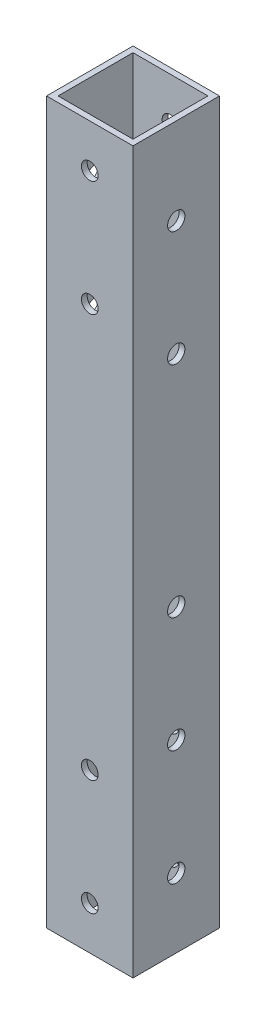
ISO-10303-21;
HEADER;
FILE_DESCRIPTION(('STEP AP214'),'2;1');
FILE_NAME('part.step','',(''),(''),'','','');
FILE_SCHEMA(('AUTOMOTIVE_DESIGN { 1 0 10303 214 1 1 1 1 }'));
ENDSEC;
DATA;
#1=APPLICATION_CONTEXT('core data for automotive mechanical design processes');
#2=APPLICATION_PROTOCOL_DEFINITION('international standard','automotive_design',2000,#1);
#3=PRODUCT_CONTEXT('',#1,'mechanical');
#4=PRODUCT('Part','Part','',(#3));
#5=PRODUCT_RELATED_PRODUCT_CATEGORY('part','',(#4));
#6=PRODUCT_DEFINITION_FORMATION('','',#4);
#7=PRODUCT_DEFINITION_CONTEXT('part definition',#1,'design');
#8=PRODUCT_DEFINITION('design','',#6,#7);
#9=PRODUCT_DEFINITION_SHAPE('','',#8);
#10=(LENGTH_UNIT() NAMED_UNIT(*) SI_UNIT(.MILLI.,.METRE.));
#11=(NAMED_UNIT(*) PLANE_ANGLE_UNIT() SI_UNIT($,.RADIAN.));
#12=(NAMED_UNIT(*) SI_UNIT($,.STERADIAN.) SOLID_ANGLE_UNIT());
#13=UNCERTAINTY_MEASURE_WITH_UNIT(LENGTH_MEASURE(1.E-05),#10,'distance_accuracy_value','');
#14=(GEOMETRIC_REPRESENTATION_CONTEXT(3) GLOBAL_UNCERTAINTY_ASSIGNED_CONTEXT((#13)) GLOBAL_UNIT_ASSIGNED_CONTEXT((#10,
#11,#12)) REPRESENTATION_CONTEXT('',''));
#15=CARTESIAN_POINT('',(0.,0.,0.));
#16=DIRECTION('',(0.,0.,1.));
#17=DIRECTION('',(1.,0.,0.));
#18=AXIS2_PLACEMENT_3D('',#15,#16,#17);
#19=CARTESIAN_POINT('',(0.,125.,0.));
#20=DIRECTION('',(0.,1.,0.));
#21=DIRECTION('',(0.,0.,1.));
#22=AXIS2_PLACEMENT_3D('',#19,#20,#21);
#23=PLANE('',#22);
#24=DIRECTION('',(0.,0.,-1.));
#25=VECTOR('',#24,1.);
#26=CARTESIAN_POINT('',(7.5,125.,7.5));
#27=LINE('',#26,#25);
#28=CARTESIAN_POINT('',(7.5,125.,7.5));
#29=VERTEX_POINT('',#28);
#30=CARTESIAN_POINT('',(7.5,125.,-7.5));
#31=VERTEX_POINT('',#30);
#32=EDGE_CURVE('E187',#29,#31,#27,.T.);
#33=ORIENTED_EDGE('',*,*,#32,.T.);
#34=DIRECTION('',(-1.,0.,0.));
#35=VECTOR('',#34,1.);
#36=CARTESIAN_POINT('',(-7.5,125.,-7.5));
#37=LINE('',#36,#35);
#38=CARTESIAN_POINT('',(-7.5,125.,-7.5));
#39=VERTEX_POINT('',#38);
#40=EDGE_CURVE('E191',#31,#39,#37,.T.);
#41=ORIENTED_EDGE('',*,*,#40,.T.);
#42=DIRECTION('',(0.,0.,1.));
#43=VECTOR('',#42,1.);
#44=CARTESIAN_POINT('',(-7.5,125.,7.5));
#45=LINE('',#44,#43);
#46=CARTESIAN_POINT('',(-7.5,125.,7.5));
#47=VERTEX_POINT('',#46);
#48=EDGE_CURVE('E195',#39,#47,#45,.T.);
#49=ORIENTED_EDGE('',*,*,#48,.T.);
#50=DIRECTION('',(1.,0.,0.));
#51=VECTOR('',#50,1.);
#52=CARTESIAN_POINT('',(-7.5,125.,7.5));
#53=LINE('',#52,#51);
#54=EDGE_CURVE('E198',#47,#29,#53,.T.);
#55=ORIENTED_EDGE('',*,*,#54,.T.);
#56=EDGE_LOOP('',(#33,#41,#49,#55));
#57=FACE_BOUND('',#56,.T.);
#58=DIRECTION('',(-1.,0.,0.));
#59=VECTOR('',#58,1.);
#60=CARTESIAN_POINT('',(0.,125.,-6.5));
#61=LINE('',#60,#59);
#62=CARTESIAN_POINT('',(6.5,125.,-6.5));
#63=VERTEX_POINT('',#62);
#64=CARTESIAN_POINT('',(-6.5,125.,-6.5));
#65=VERTEX_POINT('',#64);
#66=EDGE_CURVE('E146',#63,#65,#61,.T.);
#67=ORIENTED_EDGE('',*,*,#66,.F.);
#68=DIRECTION('',(0.,0.,-1.));
#69=VECTOR('',#68,1.);
#70=CARTESIAN_POINT('',(6.5,125.,0.));
#71=LINE('',#70,#69);
#72=CARTESIAN_POINT('',(6.5,125.,6.5));
#73=VERTEX_POINT('',#72);
#74=EDGE_CURVE('E137',#73,#63,#71,.T.);
#75=ORIENTED_EDGE('',*,*,#74,.F.);
#76=DIRECTION('',(1.,0.,0.));
#77=VECTOR('',#76,1.);
#78=CARTESIAN_POINT('',(0.,125.,6.5));
#79=LINE('',#78,#77);
#80=CARTESIAN_POINT('',(-6.5,125.,6.5));
#81=VERTEX_POINT('',#80);
#82=EDGE_CURVE('E163',#81,#73,#79,.T.);
#83=ORIENTED_EDGE('',*,*,#82,.F.);
#84=DIRECTION('',(0.,0.,1.));
#85=VECTOR('',#84,1.);
#86=CARTESIAN_POINT('',(-6.5,125.,0.));
#87=LINE('',#86,#85);
#88=EDGE_CURVE('E159',#65,#81,#87,.T.);
#89=ORIENTED_EDGE('',*,*,#88,.F.);
#90=EDGE_LOOP('',(#67,#75,#83,#89));
#91=FACE_BOUND('',#90,.T.);
#92=ADVANCED_FACE('F69',(#57,#91),#23,.T.);
#93=CARTESIAN_POINT('',(0.,0.,0.));
#94=DIRECTION('',(0.,1.,0.));
#95=DIRECTION('',(0.,0.,1.));
#96=AXIS2_PLACEMENT_3D('',#93,#94,#95);
#97=PLANE('',#96);
#98=DIRECTION('',(0.,0.,-1.));
#99=VECTOR('',#98,1.);
#100=CARTESIAN_POINT('',(7.5,0.,7.5));
#101=LINE('',#100,#99);
#102=CARTESIAN_POINT('',(7.5,0.,7.5));
#103=VERTEX_POINT('',#102);
#104=CARTESIAN_POINT('',(7.5,0.,-7.5));
#105=VERTEX_POINT('',#104);
#106=EDGE_CURVE('E155',#103,#105,#101,.T.);
#107=ORIENTED_EDGE('',*,*,#106,.F.);
#108=DIRECTION('',(1.,0.,0.));
#109=VECTOR('',#108,1.);
#110=CARTESIAN_POINT('',(-7.5,0.,7.5));
#111=LINE('',#110,#109);
#112=CARTESIAN_POINT('',(-7.5,0.,7.5));
#113=VERTEX_POINT('',#112);
#114=EDGE_CURVE('E192',#113,#103,#111,.T.);
#115=ORIENTED_EDGE('',*,*,#114,.F.);
#116=DIRECTION('',(0.,0.,1.));
#117=VECTOR('',#116,1.);
#118=CARTESIAN_POINT('',(-7.5,0.,7.5));
#119=LINE('',#118,#117);
#120=CARTESIAN_POINT('',(-7.5,0.,-7.5));
#121=VERTEX_POINT('',#120);
#122=EDGE_CURVE('E208',#121,#113,#119,.T.);
#123=ORIENTED_EDGE('',*,*,#122,.F.);
#124=DIRECTION('',(-1.,0.,0.));
#125=VECTOR('',#124,1.);
#126=CARTESIAN_POINT('',(-7.5,0.,-7.5));
#127=LINE('',#126,#125);
#128=EDGE_CURVE('E205',#105,#121,#127,.T.);
#129=ORIENTED_EDGE('',*,*,#128,.F.);
#130=EDGE_LOOP('',(#107,#115,#123,#129));
#131=FACE_BOUND('',#130,.T.);
#132=DIRECTION('',(0.,0.,-1.));
#133=VECTOR('',#132,1.);
#134=CARTESIAN_POINT('',(6.5,0.,0.));
#135=LINE('',#134,#133);
#136=CARTESIAN_POINT('',(6.5,0.,6.5));
#137=VERTEX_POINT('',#136);
#138=CARTESIAN_POINT('',(6.5,0.,-6.5));
#139=VERTEX_POINT('',#138);
#140=EDGE_CURVE('E95',#137,#139,#135,.T.);
#141=ORIENTED_EDGE('',*,*,#140,.T.);
#142=DIRECTION('',(-1.,0.,0.));
#143=VECTOR('',#142,1.);
#144=CARTESIAN_POINT('',(0.,0.,-6.5));
#145=LINE('',#144,#143);
#146=CARTESIAN_POINT('',(-6.5,0.,-6.5));
#147=VERTEX_POINT('',#146);
#148=EDGE_CURVE('E153',#139,#147,#145,.T.);
#149=ORIENTED_EDGE('',*,*,#148,.T.);
#150=DIRECTION('',(0.,0.,1.));
#151=VECTOR('',#150,1.);
#152=CARTESIAN_POINT('',(-6.5,0.,0.));
#153=LINE('',#152,#151);
#154=CARTESIAN_POINT('',(-6.5,0.,6.5));
#155=VERTEX_POINT('',#154);
#156=EDGE_CURVE('E174',#147,#155,#153,.T.);
#157=ORIENTED_EDGE('',*,*,#156,.T.);
#158=DIRECTION('',(1.,0.,0.));
#159=VECTOR('',#158,1.);
#160=CARTESIAN_POINT('',(0.,0.,6.5));
#161=LINE('',#160,#159);
#162=EDGE_CURVE('E147',#155,#137,#161,.T.);
#163=ORIENTED_EDGE('',*,*,#162,.T.);
#164=EDGE_LOOP('',(#141,#149,#157,#163));
#165=FACE_BOUND('',#164,.T.);
#166=ADVANCED_FACE('F358',(#131,#165),#97,.F.);
#167=CARTESIAN_POINT('',(7.5,125.,7.5));
#168=DIRECTION('',(-1.,0.,0.));
#169=DIRECTION('',(0.,0.,1.));
#170=AXIS2_PLACEMENT_3D('',#167,#168,#169);
#171=PLANE('',#170);
#172=CARTESIAN_POINT('',(7.5,90.,0.));
#173=DIRECTION('',(1.,0.,0.));
#174=DIRECTION('',(0.,0.,-1.));
#175=AXIS2_PLACEMENT_3D('',#172,#173,#174);
#176=CIRCLE('',#175,1.5);
#177=CARTESIAN_POINT('',(7.5,90.,-1.5));
#178=VERTEX_POINT('',#177);
#179=EDGE_CURVE('E457',#178,#178,#176,.T.);
#180=ORIENTED_EDGE('',*,*,#179,.F.);
#181=EDGE_LOOP('',(#180));
#182=FACE_BOUND('',#181,.T.);
#183=CARTESIAN_POINT('',(7.5,110.,0.));
#184=DIRECTION('',(1.,0.,0.));
#185=DIRECTION('',(0.,0.,-1.));
#186=AXIS2_PLACEMENT_3D('',#183,#184,#185);
#187=CIRCLE('',#186,1.5);
#188=CARTESIAN_POINT('',(7.5,110.,-1.5));
#189=VERTEX_POINT('',#188);
#190=EDGE_CURVE('E452',#189,#189,#187,.T.);
#191=ORIENTED_EDGE('',*,*,#190,.F.);
#192=EDGE_LOOP('',(#191));
#193=FACE_BOUND('',#192,.T.);
#194=CARTESIAN_POINT('',(7.5,52.,0.));
#195=DIRECTION('',(1.,0.,0.));
#196=DIRECTION('',(0.,0.,-1.));
#197=AXIS2_PLACEMENT_3D('',#194,#195,#196);
#198=CIRCLE('',#197,1.5);
#199=CARTESIAN_POINT('',(7.5,52.,-1.5));
#200=VERTEX_POINT('',#199);
#201=EDGE_CURVE('E444',#200,#200,#198,.T.);
#202=ORIENTED_EDGE('',*,*,#201,.F.);
#203=EDGE_LOOP('',(#202));
#204=FACE_BOUND('',#203,.T.);
#205=CARTESIAN_POINT('',(7.5,12.,0.));
#206=DIRECTION('',(1.,0.,0.));
#207=DIRECTION('',(0.,0.,-1.));
#208=AXIS2_PLACEMENT_3D('',#205,#206,#207);
#209=CIRCLE('',#208,1.5);
#210=CARTESIAN_POINT('',(7.5,12.,-1.5));
#211=VERTEX_POINT('',#210);
#212=EDGE_CURVE('E408',#211,#211,#209,.T.);
#213=ORIENTED_EDGE('',*,*,#212,.F.);
#214=EDGE_LOOP('',(#213));
#215=FACE_BOUND('',#214,.T.);
#216=CARTESIAN_POINT('',(7.5,32.,0.));
#217=DIRECTION('',(1.,0.,0.));
#218=DIRECTION('',(0.,0.,-1.));
#219=AXIS2_PLACEMENT_3D('',#216,#217,#218);
#220=CIRCLE('',#219,1.5);
#221=CARTESIAN_POINT('',(7.5,32.,-1.5));
#222=VERTEX_POINT('',#221);
#223=EDGE_CURVE('E404',#222,#222,#220,.T.);
#224=ORIENTED_EDGE('',*,*,#223,.F.);
#225=EDGE_LOOP('',(#224));
#226=FACE_BOUND('',#225,.T.);
#227=ORIENTED_EDGE('',*,*,#106,.T.);
#228=DIRECTION('',(0.,-1.,0.));
#229=VECTOR('',#228,1.);
#230=CARTESIAN_POINT('',(7.5,125.,-7.5));
#231=LINE('',#230,#229);
#232=EDGE_CURVE('E12',#31,#105,#231,.T.);
#233=ORIENTED_EDGE('',*,*,#232,.F.);
#234=ORIENTED_EDGE('',*,*,#32,.F.);
#235=DIRECTION('',(0.,-1.,0.));
#236=VECTOR('',#235,1.);
#237=CARTESIAN_POINT('',(7.5,125.,7.5));
#238=LINE('',#237,#236);
#239=EDGE_CURVE('E201',#29,#103,#238,.T.);
#240=ORIENTED_EDGE('',*,*,#239,.T.);
#241=EDGE_LOOP('',(#227,#233,#234,#240));
#242=FACE_BOUND('',#241,.T.);
#243=ADVANCED_FACE('F71',(#182,#193,#204,#215,#226,#242),#171,.F.);
#244=CARTESIAN_POINT('',(-7.5,125.,-7.5));
#245=DIRECTION('',(0.,0.,1.));
#246=DIRECTION('',(1.,0.,0.));
#247=AXIS2_PLACEMENT_3D('',#244,#245,#246);
#248=PLANE('',#247);
#249=CARTESIAN_POINT('',(0.,7.5,-7.5));
#250=DIRECTION('',(0.,0.,1.));
#251=DIRECTION('',(1.,0.,0.));
#252=AXIS2_PLACEMENT_3D('',#249,#250,#251);
#253=CIRCLE('',#252,1.45);
#254=CARTESIAN_POINT('',(1.45,7.5,-7.5));
#255=VERTEX_POINT('',#254);
#256=EDGE_CURVE('E228',#255,#255,#253,.T.);
#257=ORIENTED_EDGE('',*,*,#256,.T.);
#258=EDGE_LOOP('',(#257));
#259=FACE_BOUND('',#258,.T.);
#260=CARTESIAN_POINT('',(0.,27.5,-7.5));
#261=DIRECTION('',(0.,0.,1.));
#262=DIRECTION('',(1.,0.,0.));
#263=AXIS2_PLACEMENT_3D('',#260,#261,#262);
#264=CIRCLE('',#263,1.45);
#265=CARTESIAN_POINT('',(1.45,27.5,-7.5));
#266=VERTEX_POINT('',#265);
#267=EDGE_CURVE('E291',#266,#266,#264,.T.);
#268=ORIENTED_EDGE('',*,*,#267,.T.);
#269=EDGE_LOOP('',(#268));
#270=FACE_BOUND('',#269,.T.);
#271=CARTESIAN_POINT('',(0.,97.5,-7.5));
#272=DIRECTION('',(0.,0.,1.));
#273=DIRECTION('',(-1.,0.,0.));
#274=AXIS2_PLACEMENT_3D('',#271,#272,#273);
#275=CIRCLE('',#274,1.45);
#276=CARTESIAN_POINT('',(-1.45,97.5,-7.5));
#277=VERTEX_POINT('',#276);
#278=EDGE_CURVE('E299',#277,#277,#275,.T.);
#279=ORIENTED_EDGE('',*,*,#278,.T.);
#280=EDGE_LOOP('',(#279));
#281=FACE_BOUND('',#280,.T.);
#282=CARTESIAN_POINT('',(0.,117.5,-7.5));
#283=DIRECTION('',(0.,0.,1.));
#284=DIRECTION('',(-1.,0.,0.));
#285=AXIS2_PLACEMENT_3D('',#282,#283,#284);
#286=CIRCLE('',#285,1.45);
#287=CARTESIAN_POINT('',(-1.45,117.5,-7.5));
#288=VERTEX_POINT('',#287);
#289=EDGE_CURVE('E279',#288,#288,#286,.T.);
#290=ORIENTED_EDGE('',*,*,#289,.T.);
#291=EDGE_LOOP('',(#290));
#292=FACE_BOUND('',#291,.T.);
#293=ORIENTED_EDGE('',*,*,#128,.T.);
#294=DIRECTION('',(0.,-1.,0.));
#295=VECTOR('',#294,1.);
#296=CARTESIAN_POINT('',(-7.5,125.,-7.5));
#297=LINE('',#296,#295);
#298=EDGE_CURVE('E79',#39,#121,#297,.T.);
#299=ORIENTED_EDGE('',*,*,#298,.F.);
#300=ORIENTED_EDGE('',*,*,#40,.F.);
#301=ORIENTED_EDGE('',*,*,#232,.T.);
#302=EDGE_LOOP('',(#293,#299,#300,#301));
#303=FACE_BOUND('',#302,.T.);
#304=ADVANCED_FACE('F344',(#259,#270,#281,#292,#303),#248,.F.);
#305=CARTESIAN_POINT('',(-7.5,125.,7.5));
#306=DIRECTION('',(1.,0.,0.));
#307=DIRECTION('',(0.,0.,-1.));
#308=AXIS2_PLACEMENT_3D('',#305,#306,#307);
#309=PLANE('',#308);
#310=CARTESIAN_POINT('',(-7.5,90.,0.));
#311=DIRECTION('',(1.,0.,0.));
#312=DIRECTION('',(0.,0.,-1.));
#313=AXIS2_PLACEMENT_3D('',#310,#311,#312);
#314=CIRCLE('',#313,1.5);
#315=CARTESIAN_POINT('',(-7.5,90.,-1.5));
#316=VERTEX_POINT('',#315);
#317=EDGE_CURVE('E387',#316,#316,#314,.T.);
#318=ORIENTED_EDGE('',*,*,#317,.T.);
#319=EDGE_LOOP('',(#318));
#320=FACE_BOUND('',#319,.T.);
#321=CARTESIAN_POINT('',(-7.5,110.,0.));
#322=DIRECTION('',(1.,0.,0.));
#323=DIRECTION('',(0.,0.,-1.));
#324=AXIS2_PLACEMENT_3D('',#321,#322,#323);
#325=CIRCLE('',#324,1.5);
#326=CARTESIAN_POINT('',(-7.5,110.,-1.5));
#327=VERTEX_POINT('',#326);
#328=EDGE_CURVE('E391',#327,#327,#325,.T.);
#329=ORIENTED_EDGE('',*,*,#328,.T.);
#330=EDGE_LOOP('',(#329));
#331=FACE_BOUND('',#330,.T.);
#332=CARTESIAN_POINT('',(-7.5,52.,0.));
#333=DIRECTION('',(1.,0.,0.));
#334=DIRECTION('',(0.,0.,-1.));
#335=AXIS2_PLACEMENT_3D('',#332,#333,#334);
#336=CIRCLE('',#335,1.5);
#337=CARTESIAN_POINT('',(-7.5,52.,-1.5));
#338=VERTEX_POINT('',#337);
#339=EDGE_CURVE('E395',#338,#338,#336,.T.);
#340=ORIENTED_EDGE('',*,*,#339,.T.);
#341=EDGE_LOOP('',(#340));
#342=FACE_BOUND('',#341,.T.);
#343=CARTESIAN_POINT('',(-7.5,12.,0.));
#344=DIRECTION('',(1.,0.,0.));
#345=DIRECTION('',(0.,0.,-1.));
#346=AXIS2_PLACEMENT_3D('',#343,#344,#345);
#347=CIRCLE('',#346,1.5);
#348=CARTESIAN_POINT('',(-7.5,12.,-1.5));
#349=VERTEX_POINT('',#348);
#350=EDGE_CURVE('E399',#349,#349,#347,.T.);
#351=ORIENTED_EDGE('',*,*,#350,.T.);
#352=EDGE_LOOP('',(#351));
#353=FACE_BOUND('',#352,.T.);
#354=CARTESIAN_POINT('',(-7.5,32.,0.));
#355=DIRECTION('',(1.,0.,0.));
#356=DIRECTION('',(0.,0.,-1.));
#357=AXIS2_PLACEMENT_3D('',#354,#355,#356);
#358=CIRCLE('',#357,1.5);
#359=CARTESIAN_POINT('',(-7.5,32.,-1.5));
#360=VERTEX_POINT('',#359);
#361=EDGE_CURVE('E248',#360,#360,#358,.T.);
#362=ORIENTED_EDGE('',*,*,#361,.T.);
#363=EDGE_LOOP('',(#362));
#364=FACE_BOUND('',#363,.T.);
#365=ORIENTED_EDGE('',*,*,#122,.T.);
#366=DIRECTION('',(0.,-1.,0.));
#367=VECTOR('',#366,1.);
#368=CARTESIAN_POINT('',(-7.5,125.,7.5));
#369=LINE('',#368,#367);
#370=EDGE_CURVE('E216',#47,#113,#369,.T.);
#371=ORIENTED_EDGE('',*,*,#370,.F.);
#372=ORIENTED_EDGE('',*,*,#48,.F.);
#373=ORIENTED_EDGE('',*,*,#298,.T.);
#374=EDGE_LOOP('',(#365,#371,#372,#373));
#375=FACE_BOUND('',#374,.T.);
#376=ADVANCED_FACE('F347',(#320,#331,#342,#353,#364,#375),#309,.F.);
#377=CARTESIAN_POINT('',(-7.5,125.,7.5));
#378=DIRECTION('',(0.,0.,-1.));
#379=DIRECTION('',(-1.,0.,0.));
#380=AXIS2_PLACEMENT_3D('',#377,#378,#379);
#381=PLANE('',#380);
#382=CARTESIAN_POINT('',(0.,7.5,7.5));
#383=DIRECTION('',(0.,0.,1.));
#384=DIRECTION('',(1.,0.,0.));
#385=AXIS2_PLACEMENT_3D('',#382,#383,#384);
#386=CIRCLE('',#385,1.45);
#387=CARTESIAN_POINT('',(1.45,7.5,7.5));
#388=VERTEX_POINT('',#387);
#389=EDGE_CURVE('E283',#388,#388,#386,.T.);
#390=ORIENTED_EDGE('',*,*,#389,.F.);
#391=EDGE_LOOP('',(#390));
#392=FACE_BOUND('',#391,.T.);
#393=CARTESIAN_POINT('',(0.,27.5,7.5));
#394=DIRECTION('',(0.,0.,1.));
#395=DIRECTION('',(1.,0.,0.));
#396=AXIS2_PLACEMENT_3D('',#393,#394,#395);
#397=CIRCLE('',#396,1.45);
#398=CARTESIAN_POINT('',(1.45,27.5,7.5));
#399=VERTEX_POINT('',#398);
#400=EDGE_CURVE('E287',#399,#399,#397,.T.);
#401=ORIENTED_EDGE('',*,*,#400,.F.);
#402=EDGE_LOOP('',(#401));
#403=FACE_BOUND('',#402,.T.);
#404=CARTESIAN_POINT('',(0.,97.5,7.5));
#405=DIRECTION('',(0.,0.,1.));
#406=DIRECTION('',(-1.,0.,0.));
#407=AXIS2_PLACEMENT_3D('',#404,#405,#406);
#408=CIRCLE('',#407,1.45);
#409=CARTESIAN_POINT('',(-1.45,97.5,7.5));
#410=VERTEX_POINT('',#409);
#411=EDGE_CURVE('E295',#410,#410,#408,.T.);
#412=ORIENTED_EDGE('',*,*,#411,.F.);
#413=EDGE_LOOP('',(#412));
#414=FACE_BOUND('',#413,.T.);
#415=CARTESIAN_POINT('',(0.,117.5,7.5));
#416=DIRECTION('',(0.,0.,1.));
#417=DIRECTION('',(-1.,0.,0.));
#418=AXIS2_PLACEMENT_3D('',#415,#416,#417);
#419=CIRCLE('',#418,1.45);
#420=CARTESIAN_POINT('',(-1.45,117.5,7.5));
#421=VERTEX_POINT('',#420);
#422=EDGE_CURVE('E303',#421,#421,#419,.T.);
#423=ORIENTED_EDGE('',*,*,#422,.F.);
#424=EDGE_LOOP('',(#423));
#425=FACE_BOUND('',#424,.T.);
#426=ORIENTED_EDGE('',*,*,#114,.T.);
#427=ORIENTED_EDGE('',*,*,#239,.F.);
#428=ORIENTED_EDGE('',*,*,#54,.F.);
#429=ORIENTED_EDGE('',*,*,#370,.T.);
#430=EDGE_LOOP('',(#426,#427,#428,#429));
#431=FACE_BOUND('',#430,.T.);
#432=ADVANCED_FACE('F362',(#392,#403,#414,#425,#431),#381,.F.);
#433=CARTESIAN_POINT('',(6.5,125.,0.));
#434=DIRECTION('',(-1.,0.,0.));
#435=DIRECTION('',(0.,0.,1.));
#436=AXIS2_PLACEMENT_3D('',#433,#434,#435);
#437=PLANE('',#436);
#438=CARTESIAN_POINT('',(6.5,90.,0.));
#439=DIRECTION('',(-1.,0.,0.));
#440=DIRECTION('',(0.,0.,1.));
#441=AXIS2_PLACEMENT_3D('',#438,#439,#440);
#442=CIRCLE('',#441,1.5);
#443=CARTESIAN_POINT('',(6.5,90.,1.5));
#444=VERTEX_POINT('',#443);
#445=EDGE_CURVE('E275',#444,#444,#442,.T.);
#446=ORIENTED_EDGE('',*,*,#445,.F.);
#447=EDGE_LOOP('',(#446));
#448=FACE_BOUND('',#447,.T.);
#449=CARTESIAN_POINT('',(6.5,110.,0.));
#450=DIRECTION('',(-1.,0.,0.));
#451=DIRECTION('',(0.,0.,1.));
#452=AXIS2_PLACEMENT_3D('',#449,#450,#451);
#453=CIRCLE('',#452,1.5);
#454=CARTESIAN_POINT('',(6.5,110.,1.5));
#455=VERTEX_POINT('',#454);
#456=EDGE_CURVE('E261',#455,#455,#453,.T.);
#457=ORIENTED_EDGE('',*,*,#456,.F.);
#458=EDGE_LOOP('',(#457));
#459=FACE_BOUND('',#458,.T.);
#460=CARTESIAN_POINT('',(6.5,52.,0.));
#461=DIRECTION('',(-1.,0.,0.));
#462=DIRECTION('',(0.,0.,1.));
#463=AXIS2_PLACEMENT_3D('',#460,#461,#462);
#464=CIRCLE('',#463,1.5);
#465=CARTESIAN_POINT('',(6.5,52.,1.5));
#466=VERTEX_POINT('',#465);
#467=EDGE_CURVE('E257',#466,#466,#464,.T.);
#468=ORIENTED_EDGE('',*,*,#467,.F.);
#469=EDGE_LOOP('',(#468));
#470=FACE_BOUND('',#469,.T.);
#471=CARTESIAN_POINT('',(6.5,12.,0.));
#472=DIRECTION('',(-1.,0.,0.));
#473=DIRECTION('',(0.,0.,1.));
#474=AXIS2_PLACEMENT_3D('',#471,#472,#473);
#475=CIRCLE('',#474,1.5);
#476=CARTESIAN_POINT('',(6.5,12.,1.5));
#477=VERTEX_POINT('',#476);
#478=EDGE_CURVE('E253',#477,#477,#475,.T.);
#479=ORIENTED_EDGE('',*,*,#478,.F.);
#480=EDGE_LOOP('',(#479));
#481=FACE_BOUND('',#480,.T.);
#482=CARTESIAN_POINT('',(6.5,32.,0.));
#483=DIRECTION('',(-1.,0.,0.));
#484=DIRECTION('',(0.,0.,1.));
#485=AXIS2_PLACEMENT_3D('',#482,#483,#484);
#486=CIRCLE('',#485,1.5);
#487=CARTESIAN_POINT('',(6.5,32.,1.5));
#488=VERTEX_POINT('',#487);
#489=EDGE_CURVE('E247',#488,#488,#486,.T.);
#490=ORIENTED_EDGE('',*,*,#489,.F.);
#491=EDGE_LOOP('',(#490));
#492=FACE_BOUND('',#491,.T.);
#493=ORIENTED_EDGE('',*,*,#140,.F.);
#494=DIRECTION('',(0.,-1.,0.));
#495=VECTOR('',#494,1.);
#496=CARTESIAN_POINT('',(6.5,125.,6.5));
#497=LINE('',#496,#495);
#498=EDGE_CURVE('E141',#73,#137,#497,.T.);
#499=ORIENTED_EDGE('',*,*,#498,.F.);
#500=ORIENTED_EDGE('',*,*,#74,.T.);
#501=DIRECTION('',(0.,-1.,0.));
#502=VECTOR('',#501,1.);
#503=CARTESIAN_POINT('',(6.5,125.,-6.5));
#504=LINE('',#503,#502);
#505=EDGE_CURVE('E140',#63,#139,#504,.T.);
#506=ORIENTED_EDGE('',*,*,#505,.T.);
#507=EDGE_LOOP('',(#493,#499,#500,#506));
#508=FACE_BOUND('',#507,.T.);
#509=ADVANCED_FACE('F139',(#448,#459,#470,#481,#492,#508),#437,.T.);
#510=CARTESIAN_POINT('',(0.,125.,-6.5));
#511=DIRECTION('',(0.,0.,1.));
#512=DIRECTION('',(1.,0.,0.));
#513=AXIS2_PLACEMENT_3D('',#510,#511,#512);
#514=PLANE('',#513);
#515=CARTESIAN_POINT('',(0.,7.5,-6.5));
#516=DIRECTION('',(0.,0.,1.));
#517=DIRECTION('',(1.,0.,0.));
#518=AXIS2_PLACEMENT_3D('',#515,#516,#517);
#519=CIRCLE('',#518,1.45);
#520=CARTESIAN_POINT('',(1.45,7.5,-6.5));
#521=VERTEX_POINT('',#520);
#522=EDGE_CURVE('E171',#521,#521,#519,.T.);
#523=ORIENTED_EDGE('',*,*,#522,.F.);
#524=EDGE_LOOP('',(#523));
#525=FACE_BOUND('',#524,.T.);
#526=CARTESIAN_POINT('',(0.,27.5,-6.5));
#527=DIRECTION('',(0.,0.,1.));
#528=DIRECTION('',(1.,0.,0.));
#529=AXIS2_PLACEMENT_3D('',#526,#527,#528);
#530=CIRCLE('',#529,1.45);
#531=CARTESIAN_POINT('',(1.45,27.5,-6.5));
#532=VERTEX_POINT('',#531);
#533=EDGE_CURVE('E238',#532,#532,#530,.T.);
#534=ORIENTED_EDGE('',*,*,#533,.F.);
#535=EDGE_LOOP('',(#534));
#536=FACE_BOUND('',#535,.T.);
#537=CARTESIAN_POINT('',(0.,97.5,-6.5));
#538=DIRECTION('',(0.,0.,1.));
#539=DIRECTION('',(1.,0.,0.));
#540=AXIS2_PLACEMENT_3D('',#537,#538,#539);
#541=CIRCLE('',#540,1.45);
#542=CARTESIAN_POINT('',(1.45,97.5,-6.5));
#543=VERTEX_POINT('',#542);
#544=EDGE_CURVE('E233',#543,#543,#541,.T.);
#545=ORIENTED_EDGE('',*,*,#544,.F.);
#546=EDGE_LOOP('',(#545));
#547=FACE_BOUND('',#546,.T.);
#548=CARTESIAN_POINT('',(0.,117.5,-6.5));
#549=DIRECTION('',(0.,0.,1.));
#550=DIRECTION('',(1.,0.,0.));
#551=AXIS2_PLACEMENT_3D('',#548,#549,#550);
#552=CIRCLE('',#551,1.45);
#553=CARTESIAN_POINT('',(1.45,117.5,-6.5));
#554=VERTEX_POINT('',#553);
#555=EDGE_CURVE('E227',#554,#554,#552,.T.);
#556=ORIENTED_EDGE('',*,*,#555,.F.);
#557=EDGE_LOOP('',(#556));
#558=FACE_BOUND('',#557,.T.);
#559=ORIENTED_EDGE('',*,*,#148,.F.);
#560=ORIENTED_EDGE('',*,*,#505,.F.);
#561=ORIENTED_EDGE('',*,*,#66,.T.);
#562=DIRECTION('',(0.,-1.,0.));
#563=VECTOR('',#562,1.);
#564=CARTESIAN_POINT('',(-6.5,125.,-6.5));
#565=LINE('',#564,#563);
#566=EDGE_CURVE('E156',#65,#147,#565,.T.);
#567=ORIENTED_EDGE('',*,*,#566,.T.);
#568=EDGE_LOOP('',(#559,#560,#561,#567));
#569=FACE_BOUND('',#568,.T.);
#570=ADVANCED_FACE('F150',(#525,#536,#547,#558,#569),#514,.T.);
#571=CARTESIAN_POINT('',(-6.5,125.,0.));
#572=DIRECTION('',(1.,0.,0.));
#573=DIRECTION('',(0.,0.,-1.));
#574=AXIS2_PLACEMENT_3D('',#571,#572,#573);
#575=PLANE('',#574);
#576=CARTESIAN_POINT('',(-6.5,90.,0.));
#577=DIRECTION('',(1.,0.,0.));
#578=DIRECTION('',(0.,0.,-1.));
#579=AXIS2_PLACEMENT_3D('',#576,#577,#578);
#580=CIRCLE('',#579,1.5);
#581=CARTESIAN_POINT('',(-6.5,90.,-1.5));
#582=VERTEX_POINT('',#581);
#583=EDGE_CURVE('E73',#582,#582,#580,.T.);
#584=ORIENTED_EDGE('',*,*,#583,.F.);
#585=EDGE_LOOP('',(#584));
#586=FACE_BOUND('',#585,.T.);
#587=CARTESIAN_POINT('',(-6.5,110.,0.));
#588=DIRECTION('',(1.,0.,0.));
#589=DIRECTION('',(0.,0.,-1.));
#590=AXIS2_PLACEMENT_3D('',#587,#588,#589);
#591=CIRCLE('',#590,1.5);
#592=CARTESIAN_POINT('',(-6.5,110.,-1.5));
#593=VERTEX_POINT('',#592);
#594=EDGE_CURVE('E258',#593,#593,#591,.T.);
#595=ORIENTED_EDGE('',*,*,#594,.F.);
#596=EDGE_LOOP('',(#595));
#597=FACE_BOUND('',#596,.T.);
#598=CARTESIAN_POINT('',(-6.5,52.,0.));
#599=DIRECTION('',(1.,0.,0.));
#600=DIRECTION('',(0.,0.,-1.));
#601=AXIS2_PLACEMENT_3D('',#598,#599,#600);
#602=CIRCLE('',#601,1.5);
#603=CARTESIAN_POINT('',(-6.5,52.,-1.5));
#604=VERTEX_POINT('',#603);
#605=EDGE_CURVE('E254',#604,#604,#602,.T.);
#606=ORIENTED_EDGE('',*,*,#605,.F.);
#607=EDGE_LOOP('',(#606));
#608=FACE_BOUND('',#607,.T.);
#609=CARTESIAN_POINT('',(-6.5,12.,0.));
#610=DIRECTION('',(1.,0.,0.));
#611=DIRECTION('',(0.,0.,-1.));
#612=AXIS2_PLACEMENT_3D('',#609,#610,#611);
#613=CIRCLE('',#612,1.5);
#614=CARTESIAN_POINT('',(-6.5,12.,-1.5));
#615=VERTEX_POINT('',#614);
#616=EDGE_CURVE('E249',#615,#615,#613,.T.);
#617=ORIENTED_EDGE('',*,*,#616,.F.);
#618=EDGE_LOOP('',(#617));
#619=FACE_BOUND('',#618,.T.);
#620=CARTESIAN_POINT('',(-6.5,32.,0.));
#621=DIRECTION('',(1.,0.,0.));
#622=DIRECTION('',(0.,0.,-1.));
#623=AXIS2_PLACEMENT_3D('',#620,#621,#622);
#624=CIRCLE('',#623,1.5);
#625=CARTESIAN_POINT('',(-6.5,32.,-1.5));
#626=VERTEX_POINT('',#625);
#627=EDGE_CURVE('E243',#626,#626,#624,.T.);
#628=ORIENTED_EDGE('',*,*,#627,.F.);
#629=EDGE_LOOP('',(#628));
#630=FACE_BOUND('',#629,.T.);
#631=ORIENTED_EDGE('',*,*,#156,.F.);
#632=ORIENTED_EDGE('',*,*,#566,.F.);
#633=ORIENTED_EDGE('',*,*,#88,.T.);
#634=DIRECTION('',(0.,-1.,0.));
#635=VECTOR('',#634,1.);
#636=CARTESIAN_POINT('',(-6.5,125.,6.5));
#637=LINE('',#636,#635);
#638=EDGE_CURVE('E87',#81,#155,#637,.T.);
#639=ORIENTED_EDGE('',*,*,#638,.T.);
#640=EDGE_LOOP('',(#631,#632,#633,#639));
#641=FACE_BOUND('',#640,.T.);
#642=ADVANCED_FACE('F327',(#586,#597,#608,#619,#630,#641),#575,.T.);
#643=CARTESIAN_POINT('',(0.,125.,6.5));
#644=DIRECTION('',(0.,0.,-1.));
#645=DIRECTION('',(-1.,0.,0.));
#646=AXIS2_PLACEMENT_3D('',#643,#644,#645);
#647=PLANE('',#646);
#648=CARTESIAN_POINT('',(0.,7.5,6.5));
#649=DIRECTION('',(0.,0.,-1.));
#650=DIRECTION('',(-1.,0.,0.));
#651=AXIS2_PLACEMENT_3D('',#648,#649,#650);
#652=CIRCLE('',#651,1.45);
#653=CARTESIAN_POINT('',(-1.45,7.5,6.5));
#654=VERTEX_POINT('',#653);
#655=EDGE_CURVE('E239',#654,#654,#652,.T.);
#656=ORIENTED_EDGE('',*,*,#655,.F.);
#657=EDGE_LOOP('',(#656));
#658=FACE_BOUND('',#657,.T.);
#659=CARTESIAN_POINT('',(0.,27.5,6.5));
#660=DIRECTION('',(0.,0.,-1.));
#661=DIRECTION('',(-1.,0.,0.));
#662=AXIS2_PLACEMENT_3D('',#659,#660,#661);
#663=CIRCLE('',#662,1.45);
#664=CARTESIAN_POINT('',(-1.45,27.5,6.5));
#665=VERTEX_POINT('',#664);
#666=EDGE_CURVE('E234',#665,#665,#663,.T.);
#667=ORIENTED_EDGE('',*,*,#666,.F.);
#668=EDGE_LOOP('',(#667));
#669=FACE_BOUND('',#668,.T.);
#670=CARTESIAN_POINT('',(0.,97.5,6.5));
#671=DIRECTION('',(0.,0.,-1.));
#672=DIRECTION('',(-1.,0.,0.));
#673=AXIS2_PLACEMENT_3D('',#670,#671,#672);
#674=CIRCLE('',#673,1.45);
#675=CARTESIAN_POINT('',(-1.45,97.5,6.5));
#676=VERTEX_POINT('',#675);
#677=EDGE_CURVE('E229',#676,#676,#674,.T.);
#678=ORIENTED_EDGE('',*,*,#677,.F.);
#679=EDGE_LOOP('',(#678));
#680=FACE_BOUND('',#679,.T.);
#681=CARTESIAN_POINT('',(0.,117.5,6.5));
#682=DIRECTION('',(0.,0.,-1.));
#683=DIRECTION('',(-1.,0.,0.));
#684=AXIS2_PLACEMENT_3D('',#681,#682,#683);
#685=CIRCLE('',#684,1.45);
#686=CARTESIAN_POINT('',(-1.45,117.5,6.5));
#687=VERTEX_POINT('',#686);
#688=EDGE_CURVE('E223',#687,#687,#685,.T.);
#689=ORIENTED_EDGE('',*,*,#688,.F.);
#690=EDGE_LOOP('',(#689));
#691=FACE_BOUND('',#690,.T.);
#692=ORIENTED_EDGE('',*,*,#162,.F.);
#693=ORIENTED_EDGE('',*,*,#638,.F.);
#694=ORIENTED_EDGE('',*,*,#82,.T.);
#695=ORIENTED_EDGE('',*,*,#498,.T.);
#696=EDGE_LOOP('',(#692,#693,#694,#695));
#697=FACE_BOUND('',#696,.T.);
#698=ADVANCED_FACE('F494',(#658,#669,#680,#691,#697),#647,.T.);
#699=CARTESIAN_POINT('',(0.,117.5,-7.5));
#700=DIRECTION('',(0.,0.,1.));
#701=DIRECTION('',(1.,0.,0.));
#702=AXIS2_PLACEMENT_3D('',#699,#700,#701);
#703=CYLINDRICAL_SURFACE('',#702,1.45);
#704=ORIENTED_EDGE('',*,*,#688,.T.);
#705=EDGE_LOOP('',(#704));
#706=FACE_BOUND('',#705,.T.);
#707=ORIENTED_EDGE('',*,*,#422,.T.);
#708=EDGE_LOOP('',(#707));
#709=FACE_BOUND('',#708,.T.);
#710=ADVANCED_FACE('F341',(#706,#709),#703,.F.);
#711=CARTESIAN_POINT('',(0.,97.5,-7.5));
#712=DIRECTION('',(0.,0.,1.));
#713=DIRECTION('',(1.,0.,0.));
#714=AXIS2_PLACEMENT_3D('',#711,#712,#713);
#715=CYLINDRICAL_SURFACE('',#714,1.45);
#716=ORIENTED_EDGE('',*,*,#677,.T.);
#717=EDGE_LOOP('',(#716));
#718=FACE_BOUND('',#717,.T.);
#719=ORIENTED_EDGE('',*,*,#411,.T.);
#720=EDGE_LOOP('',(#719));
#721=FACE_BOUND('',#720,.T.);
#722=ADVANCED_FACE('F504',(#718,#721),#715,.F.);
#723=CARTESIAN_POINT('',(0.,27.5,-7.5));
#724=DIRECTION('',(0.,0.,1.));
#725=DIRECTION('',(1.,0.,0.));
#726=AXIS2_PLACEMENT_3D('',#723,#724,#725);
#727=CYLINDRICAL_SURFACE('',#726,1.45);
#728=ORIENTED_EDGE('',*,*,#666,.T.);
#729=EDGE_LOOP('',(#728));
#730=FACE_BOUND('',#729,.T.);
#731=ORIENTED_EDGE('',*,*,#400,.T.);
#732=EDGE_LOOP('',(#731));
#733=FACE_BOUND('',#732,.T.);
#734=ADVANCED_FACE('F511',(#730,#733),#727,.F.);
#735=CARTESIAN_POINT('',(0.,7.5,-7.5));
#736=DIRECTION('',(0.,0.,1.));
#737=DIRECTION('',(1.,0.,0.));
#738=AXIS2_PLACEMENT_3D('',#735,#736,#737);
#739=CYLINDRICAL_SURFACE('',#738,1.45);
#740=ORIENTED_EDGE('',*,*,#655,.T.);
#741=EDGE_LOOP('',(#740));
#742=FACE_BOUND('',#741,.T.);
#743=ORIENTED_EDGE('',*,*,#389,.T.);
#744=EDGE_LOOP('',(#743));
#745=FACE_BOUND('',#744,.T.);
#746=ADVANCED_FACE('F339',(#742,#745),#739,.F.);
#747=ORIENTED_EDGE('',*,*,#555,.T.);
#748=EDGE_LOOP('',(#747));
#749=FACE_BOUND('',#748,.T.);
#750=ORIENTED_EDGE('',*,*,#289,.F.);
#751=EDGE_LOOP('',(#750));
#752=FACE_BOUND('',#751,.T.);
#753=ADVANCED_FACE('F335',(#749,#752),#703,.F.);
#754=ORIENTED_EDGE('',*,*,#544,.T.);
#755=EDGE_LOOP('',(#754));
#756=FACE_BOUND('',#755,.T.);
#757=ORIENTED_EDGE('',*,*,#278,.F.);
#758=EDGE_LOOP('',(#757));
#759=FACE_BOUND('',#758,.T.);
#760=ADVANCED_FACE('F338',(#756,#759),#715,.F.);
#761=ORIENTED_EDGE('',*,*,#533,.T.);
#762=EDGE_LOOP('',(#761));
#763=FACE_BOUND('',#762,.T.);
#764=ORIENTED_EDGE('',*,*,#267,.F.);
#765=EDGE_LOOP('',(#764));
#766=FACE_BOUND('',#765,.T.);
#767=ADVANCED_FACE('F490',(#763,#766),#727,.F.);
#768=ORIENTED_EDGE('',*,*,#522,.T.);
#769=EDGE_LOOP('',(#768));
#770=FACE_BOUND('',#769,.T.);
#771=ORIENTED_EDGE('',*,*,#256,.F.);
#772=EDGE_LOOP('',(#771));
#773=FACE_BOUND('',#772,.T.);
#774=ADVANCED_FACE('F322',(#770,#773),#739,.F.);
#775=CARTESIAN_POINT('',(-7.5,32.,0.));
#776=DIRECTION('',(1.,0.,0.));
#777=DIRECTION('',(0.,0.,-1.));
#778=AXIS2_PLACEMENT_3D('',#775,#776,#777);
#779=CYLINDRICAL_SURFACE('',#778,1.5);
#780=ORIENTED_EDGE('',*,*,#627,.T.);
#781=EDGE_LOOP('',(#780));
#782=FACE_BOUND('',#781,.T.);
#783=ORIENTED_EDGE('',*,*,#361,.F.);
#784=EDGE_LOOP('',(#783));
#785=FACE_BOUND('',#784,.T.);
#786=ADVANCED_FACE('F474',(#782,#785),#779,.F.);
#787=CARTESIAN_POINT('',(-7.5,12.,0.));
#788=DIRECTION('',(1.,0.,0.));
#789=DIRECTION('',(0.,0.,-1.));
#790=AXIS2_PLACEMENT_3D('',#787,#788,#789);
#791=CYLINDRICAL_SURFACE('',#790,1.5);
#792=ORIENTED_EDGE('',*,*,#616,.T.);
#793=EDGE_LOOP('',(#792));
#794=FACE_BOUND('',#793,.T.);
#795=ORIENTED_EDGE('',*,*,#350,.F.);
#796=EDGE_LOOP('',(#795));
#797=FACE_BOUND('',#796,.T.);
#798=ADVANCED_FACE('F437',(#794,#797),#791,.F.);
#799=CARTESIAN_POINT('',(-7.5,52.,0.));
#800=DIRECTION('',(1.,0.,0.));
#801=DIRECTION('',(0.,0.,-1.));
#802=AXIS2_PLACEMENT_3D('',#799,#800,#801);
#803=CYLINDRICAL_SURFACE('',#802,1.5);
#804=ORIENTED_EDGE('',*,*,#605,.T.);
#805=EDGE_LOOP('',(#804));
#806=FACE_BOUND('',#805,.T.);
#807=ORIENTED_EDGE('',*,*,#339,.F.);
#808=EDGE_LOOP('',(#807));
#809=FACE_BOUND('',#808,.T.);
#810=ADVANCED_FACE('F487',(#806,#809),#803,.F.);
#811=CARTESIAN_POINT('',(-7.5,110.,0.));
#812=DIRECTION('',(1.,0.,0.));
#813=DIRECTION('',(0.,0.,-1.));
#814=AXIS2_PLACEMENT_3D('',#811,#812,#813);
#815=CYLINDRICAL_SURFACE('',#814,1.5);
#816=ORIENTED_EDGE('',*,*,#594,.T.);
#817=EDGE_LOOP('',(#816));
#818=FACE_BOUND('',#817,.T.);
#819=ORIENTED_EDGE('',*,*,#328,.F.);
#820=EDGE_LOOP('',(#819));
#821=FACE_BOUND('',#820,.T.);
#822=ADVANCED_FACE('F478',(#818,#821),#815,.F.);
#823=CARTESIAN_POINT('',(-7.5,90.,0.));
#824=DIRECTION('',(1.,0.,0.));
#825=DIRECTION('',(0.,0.,-1.));
#826=AXIS2_PLACEMENT_3D('',#823,#824,#825);
#827=CYLINDRICAL_SURFACE('',#826,1.5);
#828=ORIENTED_EDGE('',*,*,#583,.T.);
#829=EDGE_LOOP('',(#828));
#830=FACE_BOUND('',#829,.T.);
#831=ORIENTED_EDGE('',*,*,#317,.F.);
#832=EDGE_LOOP('',(#831));
#833=FACE_BOUND('',#832,.T.);
#834=ADVANCED_FACE('F472',(#830,#833),#827,.F.);
#835=ORIENTED_EDGE('',*,*,#489,.T.);
#836=EDGE_LOOP('',(#835));
#837=FACE_BOUND('',#836,.T.);
#838=ORIENTED_EDGE('',*,*,#223,.T.);
#839=EDGE_LOOP('',(#838));
#840=FACE_BOUND('',#839,.T.);
#841=ADVANCED_FACE('F416',(#837,#840),#779,.F.);
#842=ORIENTED_EDGE('',*,*,#478,.T.);
#843=EDGE_LOOP('',(#842));
#844=FACE_BOUND('',#843,.T.);
#845=ORIENTED_EDGE('',*,*,#212,.T.);
#846=EDGE_LOOP('',(#845));
#847=FACE_BOUND('',#846,.T.);
#848=ADVANCED_FACE('F432',(#844,#847),#791,.F.);
#849=ORIENTED_EDGE('',*,*,#467,.T.);
#850=EDGE_LOOP('',(#849));
#851=FACE_BOUND('',#850,.T.);
#852=ORIENTED_EDGE('',*,*,#201,.T.);
#853=EDGE_LOOP('',(#852));
#854=FACE_BOUND('',#853,.T.);
#855=ADVANCED_FACE('F435',(#851,#854),#803,.F.);
#856=ORIENTED_EDGE('',*,*,#456,.T.);
#857=EDGE_LOOP('',(#856));
#858=FACE_BOUND('',#857,.T.);
#859=ORIENTED_EDGE('',*,*,#190,.T.);
#860=EDGE_LOOP('',(#859));
#861=FACE_BOUND('',#860,.T.);
#862=ADVANCED_FACE('F649',(#858,#861),#815,.F.);
#863=ORIENTED_EDGE('',*,*,#445,.T.);
#864=EDGE_LOOP('',(#863));
#865=FACE_BOUND('',#864,.T.);
#866=ORIENTED_EDGE('',*,*,#179,.T.);
#867=EDGE_LOOP('',(#866));
#868=FACE_BOUND('',#867,.T.);
#869=ADVANCED_FACE('F463',(#865,#868),#827,.F.);
#870=CLOSED_SHELL('',(#92,#166,#243,#304,#376,#432,#509,#570,#642,#698,#710,#722,#734,#746,#753,
#760,#767,#774,#786,#798,#810,#822,#834,#841,#848,#855,#862,#869));
#871=MANIFOLD_SOLID_BREP('B2',#870);
#872=ADVANCED_BREP_SHAPE_REPRESENTATION('',(#18,#871),#14);
#873=SHAPE_DEFINITION_REPRESENTATION(#9,#872);
ENDSEC;
END-ISO-10303-21;
